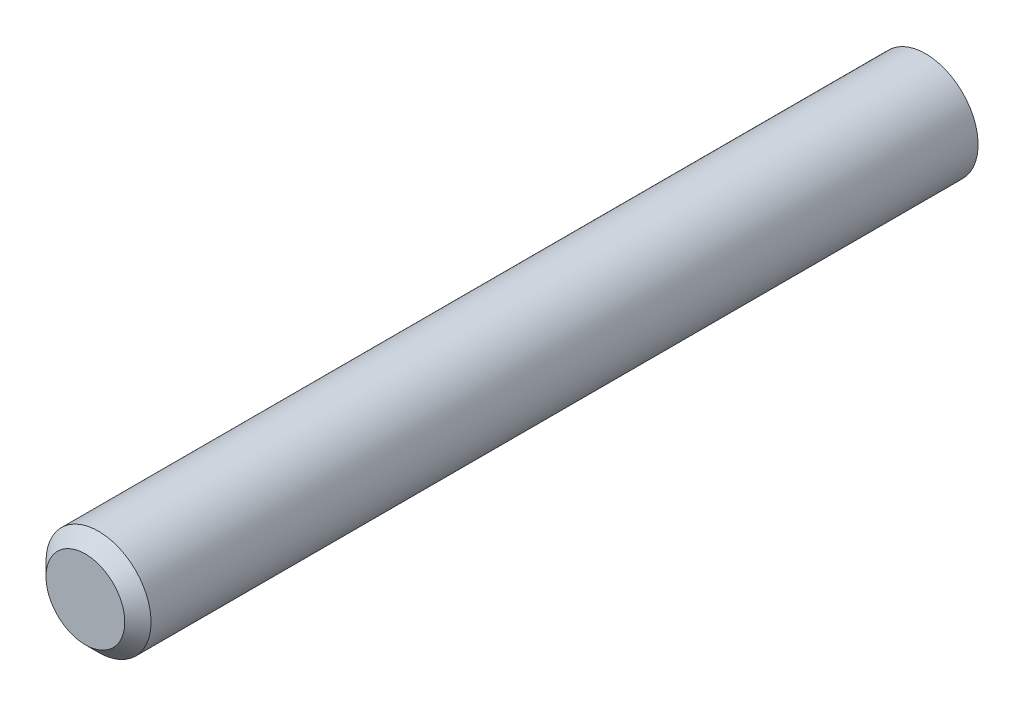
ISO-10303-21;
HEADER;
FILE_DESCRIPTION(('STEP AP214'),'2;1');
FILE_NAME('part.step','',(''),(''),'','','');
FILE_SCHEMA(('AUTOMOTIVE_DESIGN { 1 0 10303 214 1 1 1 1 }'));
ENDSEC;
DATA;
#1=APPLICATION_CONTEXT('core data for automotive mechanical design processes');
#2=APPLICATION_PROTOCOL_DEFINITION('international standard','automotive_design',2000,#1);
#3=PRODUCT_CONTEXT('',#1,'mechanical');
#4=PRODUCT('Part','Part','',(#3));
#5=PRODUCT_RELATED_PRODUCT_CATEGORY('part','',(#4));
#6=PRODUCT_DEFINITION_FORMATION('','',#4);
#7=PRODUCT_DEFINITION_CONTEXT('part definition',#1,'design');
#8=PRODUCT_DEFINITION('design','',#6,#7);
#9=PRODUCT_DEFINITION_SHAPE('','',#8);
#10=(LENGTH_UNIT() NAMED_UNIT(*) SI_UNIT(.MILLI.,.METRE.));
#11=(NAMED_UNIT(*) PLANE_ANGLE_UNIT() SI_UNIT($,.RADIAN.));
#12=(NAMED_UNIT(*) SI_UNIT($,.STERADIAN.) SOLID_ANGLE_UNIT());
#13=UNCERTAINTY_MEASURE_WITH_UNIT(LENGTH_MEASURE(1.E-05),#10,'distance_accuracy_value','');
#14=(GEOMETRIC_REPRESENTATION_CONTEXT(3) GLOBAL_UNCERTAINTY_ASSIGNED_CONTEXT((#13)) GLOBAL_UNIT_ASSIGNED_CONTEXT((#10,
#11,#12)) REPRESENTATION_CONTEXT('',''));
#15=CARTESIAN_POINT('',(0.,0.,0.));
#16=DIRECTION('',(0.,0.,1.));
#17=DIRECTION('',(1.,0.,0.));
#18=AXIS2_PLACEMENT_3D('',#15,#16,#17);
#19=CARTESIAN_POINT('',(0.,0.,16.));
#20=DIRECTION('',(0.,0.,1.));
#21=DIRECTION('',(1.,0.,0.));
#22=AXIS2_PLACEMENT_3D('',#19,#20,#21);
#23=PLANE('',#22);
#24=CARTESIAN_POINT('',(0.,0.,15.9999999999059));
#25=DIRECTION('',(0.,0.,-1.));
#26=DIRECTION('',(-1.,0.,0.));
#27=AXIS2_PLACEMENT_3D('',#24,#25,#26);
#28=CIRCLE('',#27,0.749999999982265);
#29=CARTESIAN_POINT('',(-0.749999999982265,0.,15.9999999999059));
#30=VERTEX_POINT('',#29);
#31=EDGE_CURVE('E18',#30,#30,#28,.T.);
#32=ORIENTED_EDGE('',*,*,#31,.F.);
#33=EDGE_LOOP('',(#32));
#34=FACE_BOUND('',#33,.T.);
#35=ADVANCED_FACE('F15',(#34),#23,.T.);
#36=CARTESIAN_POINT('',(0.,0.,15.7500000000255));
#37=DIRECTION('',(0.,0.,-1.));
#38=DIRECTION('',(-1.,0.,0.));
#39=AXIS2_PLACEMENT_3D('',#36,#37,#38);
#40=CONICAL_SURFACE('',#39,0.999999999862666,0.785398163397448);
#41=CARTESIAN_POINT('',(0.,0.,15.75));
#42=DIRECTION('',(0.,0.,-1.));
#43=DIRECTION('',(-1.,0.,0.));
#44=AXIS2_PLACEMENT_3D('',#41,#42,#43);
#45=CIRCLE('',#44,1.);
#46=CARTESIAN_POINT('',(-1.,0.,15.75));
#47=VERTEX_POINT('',#46);
#48=EDGE_CURVE('E22',#47,#47,#45,.T.);
#49=ORIENTED_EDGE('',*,*,#48,.F.);
#50=EDGE_LOOP('',(#49));
#51=FACE_BOUND('',#50,.T.);
#52=ORIENTED_EDGE('',*,*,#31,.T.);
#53=EDGE_LOOP('',(#52));
#54=FACE_BOUND('',#53,.T.);
#55=ADVANCED_FACE('F32',(#51,#54),#40,.T.);
#56=CARTESIAN_POINT('',(0.,0.,0.));
#57=DIRECTION('',(0.,0.,1.));
#58=DIRECTION('',(1.,0.,0.));
#59=AXIS2_PLACEMENT_3D('',#56,#57,#58);
#60=PLANE('',#59);
#61=CARTESIAN_POINT('',(0.,0.,0.));
#62=DIRECTION('',(0.,0.,-1.));
#63=DIRECTION('',(-1.,0.,0.));
#64=AXIS2_PLACEMENT_3D('',#61,#62,#63);
#65=CIRCLE('',#64,1.);
#66=CARTESIAN_POINT('',(-1.,0.,0.));
#67=VERTEX_POINT('',#66);
#68=EDGE_CURVE('E10',#67,#67,#65,.F.);
#69=ORIENTED_EDGE('',*,*,#68,.F.);
#70=EDGE_LOOP('',(#69));
#71=FACE_BOUND('',#70,.T.);
#72=ADVANCED_FACE('F39',(#71),#60,.F.);
#73=CARTESIAN_POINT('',(0.,0.,16.));
#74=DIRECTION('',(0.,0.,-1.));
#75=DIRECTION('',(-1.,0.,0.));
#76=AXIS2_PLACEMENT_3D('',#73,#74,#75);
#77=CYLINDRICAL_SURFACE('',#76,1.);
#78=ORIENTED_EDGE('',*,*,#68,.T.);
#79=EDGE_LOOP('',(#78));
#80=FACE_BOUND('',#79,.T.);
#81=ORIENTED_EDGE('',*,*,#48,.T.);
#82=EDGE_LOOP('',(#81));
#83=FACE_BOUND('',#82,.T.);
#84=ADVANCED_FACE('F41',(#80,#83),#77,.T.);
#85=CLOSED_SHELL('',(#35,#55,#72,#84));
#86=MANIFOLD_SOLID_BREP('B1',#85);
#87=ADVANCED_BREP_SHAPE_REPRESENTATION('',(#18,#86),#14);
#88=SHAPE_DEFINITION_REPRESENTATION(#9,#87);
ENDSEC;
END-ISO-10303-21;
